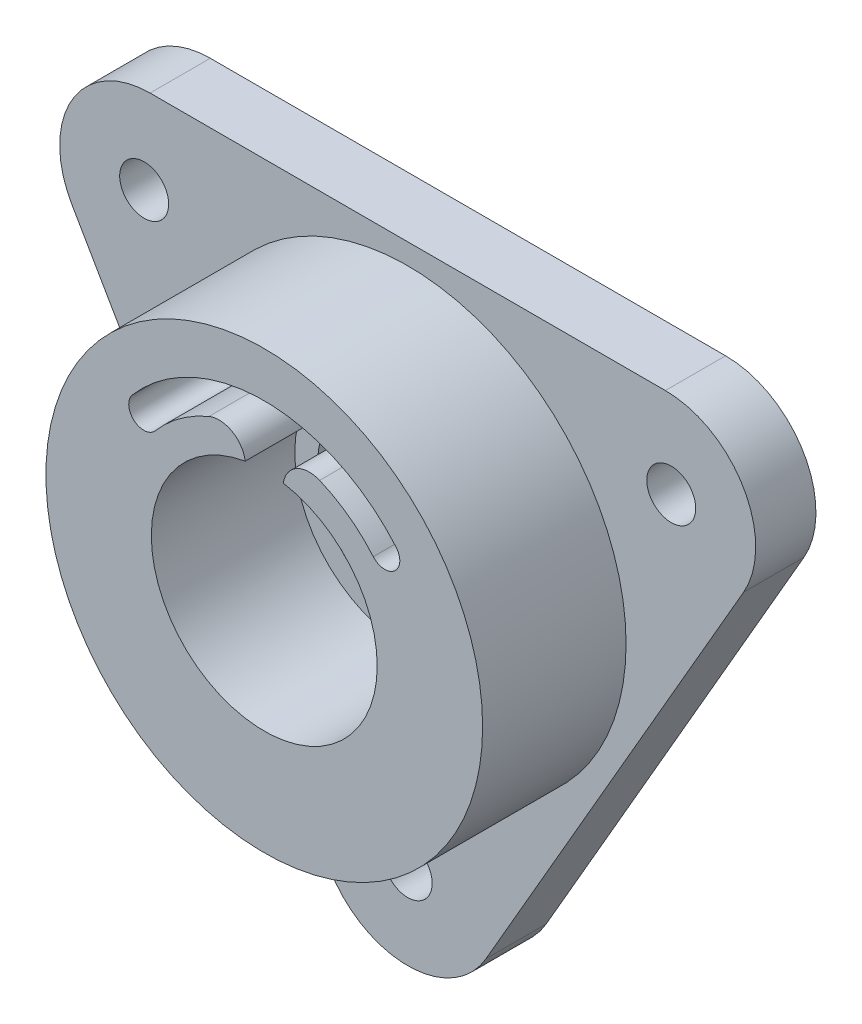
ISO-10303-21;
HEADER;
FILE_DESCRIPTION(('STEP AP214'),'2;1');
FILE_NAME('part.step','',(''),(''),'','','');
FILE_SCHEMA(('AUTOMOTIVE_DESIGN { 1 0 10303 214 1 1 1 1 }'));
ENDSEC;
DATA;
#1=APPLICATION_CONTEXT('core data for automotive mechanical design processes');
#2=APPLICATION_PROTOCOL_DEFINITION('international standard','automotive_design',2000,#1);
#3=PRODUCT_CONTEXT('',#1,'mechanical');
#4=PRODUCT('Part','Part','',(#3));
#5=PRODUCT_RELATED_PRODUCT_CATEGORY('part','',(#4));
#6=PRODUCT_DEFINITION_FORMATION('','',#4);
#7=PRODUCT_DEFINITION_CONTEXT('part definition',#1,'design');
#8=PRODUCT_DEFINITION('design','',#6,#7);
#9=PRODUCT_DEFINITION_SHAPE('','',#8);
#10=(LENGTH_UNIT() NAMED_UNIT(*) SI_UNIT(.MILLI.,.METRE.));
#11=(NAMED_UNIT(*) PLANE_ANGLE_UNIT() SI_UNIT($,.RADIAN.));
#12=(NAMED_UNIT(*) SI_UNIT($,.STERADIAN.) SOLID_ANGLE_UNIT());
#13=UNCERTAINTY_MEASURE_WITH_UNIT(LENGTH_MEASURE(1.E-05),#10,'distance_accuracy_value','');
#14=(GEOMETRIC_REPRESENTATION_CONTEXT(3) GLOBAL_UNCERTAINTY_ASSIGNED_CONTEXT((#13)) GLOBAL_UNIT_ASSIGNED_CONTEXT((#10,
#11,#12)) REPRESENTATION_CONTEXT('',''));
#15=CARTESIAN_POINT('',(0.,0.,0.));
#16=DIRECTION('',(0.,0.,1.));
#17=DIRECTION('',(1.,0.,0.));
#18=AXIS2_PLACEMENT_3D('',#15,#16,#17);
#19=CARTESIAN_POINT('',(0.,0.,0.));
#20=DIRECTION('',(0.,0.,-1.));
#21=DIRECTION('',(-1.,0.,0.));
#22=AXIS2_PLACEMENT_3D('',#19,#20,#21);
#23=PLANE('',#22);
#24=CARTESIAN_POINT('',(-17.5,10.1036297108185,0.));
#25=DIRECTION('',(0.,0.,1.));
#26=DIRECTION('',(1.,0.,0.));
#27=AXIS2_PLACEMENT_3D('',#24,#25,#26);
#28=CIRCLE('',#27,1.625);
#29=CARTESIAN_POINT('',(-15.875,10.1036297108185,0.));
#30=VERTEX_POINT('',#29);
#31=EDGE_CURVE('E182',#30,#30,#28,.T.);
#32=ORIENTED_EDGE('',*,*,#31,.T.);
#33=EDGE_LOOP('',(#32));
#34=FACE_BOUND('',#33,.T.);
#35=CARTESIAN_POINT('',(17.5,10.1036297108185,0.));
#36=DIRECTION('',(0.,0.,1.));
#37=DIRECTION('',(1.,0.,0.));
#38=AXIS2_PLACEMENT_3D('',#35,#36,#37);
#39=CIRCLE('',#38,1.625);
#40=CARTESIAN_POINT('',(19.125,10.1036297108185,0.));
#41=VERTEX_POINT('',#40);
#42=EDGE_CURVE('E201',#41,#41,#39,.T.);
#43=ORIENTED_EDGE('',*,*,#42,.T.);
#44=EDGE_LOOP('',(#43));
#45=FACE_BOUND('',#44,.T.);
#46=DIRECTION('',(-1.,0.,0.));
#47=VECTOR('',#46,1.);
#48=CARTESIAN_POINT('',(-27.5,15.8771324027147,0.));
#49=LINE('',#48,#47);
#50=CARTESIAN_POINT('',(17.1076951545867,15.8771324027147,0.));
#51=VERTEX_POINT('',#50);
#52=CARTESIAN_POINT('',(-17.1076951545867,15.8771324027147,0.));
#53=VERTEX_POINT('',#52);
#54=EDGE_CURVE('E230',#51,#53,#49,.T.);
#55=ORIENTED_EDGE('',*,*,#54,.F.);
#56=CARTESIAN_POINT('',(17.1076951545867,9.87713240271472,0.));
#57=DIRECTION('',(0.,0.,-1.));
#58=DIRECTION('',(-1.,0.,0.));
#59=AXIS2_PLACEMENT_3D('',#56,#57,#58);
#60=CIRCLE('',#59,6.);
#61=CARTESIAN_POINT('',(22.3038475772934,6.87713240271471,0.));
#62=VERTEX_POINT('',#61);
#63=EDGE_CURVE('E250',#51,#62,#60,.T.);
#64=ORIENTED_EDGE('',*,*,#63,.T.);
#65=DIRECTION('',(0.5,0.866025403784439,0.));
#66=VECTOR('',#65,1.);
#67=CARTESIAN_POINT('',(27.5,15.8771324027147,0.));
#68=LINE('',#67,#66);
#69=CARTESIAN_POINT('',(5.19615242270663,-22.7542648054294,0.));
#70=VERTEX_POINT('',#69);
#71=EDGE_CURVE('E209',#70,#62,#68,.T.);
#72=ORIENTED_EDGE('',*,*,#71,.F.);
#73=CARTESIAN_POINT('',(0.,-19.7542648054294,0.));
#74=DIRECTION('',(0.,0.,-1.));
#75=DIRECTION('',(-1.,0.,0.));
#76=AXIS2_PLACEMENT_3D('',#73,#74,#75);
#77=CIRCLE('',#76,6.);
#78=CARTESIAN_POINT('',(-5.19615242270664,-22.7542648054294,0.));
#79=VERTEX_POINT('',#78);
#80=EDGE_CURVE('E244',#70,#79,#77,.T.);
#81=ORIENTED_EDGE('',*,*,#80,.T.);
#82=DIRECTION('',(0.5,-0.866025403784439,0.));
#83=VECTOR('',#82,1.);
#84=CARTESIAN_POINT('',(0.,-31.7542648054294,0.));
#85=LINE('',#84,#83);
#86=CARTESIAN_POINT('',(-22.3038475772934,6.87713240271472,0.));
#87=VERTEX_POINT('',#86);
#88=EDGE_CURVE('E218',#87,#79,#85,.T.);
#89=ORIENTED_EDGE('',*,*,#88,.F.);
#90=CARTESIAN_POINT('',(-17.1076951545867,9.87713240271472,0.));
#91=DIRECTION('',(0.,0.,-1.));
#92=DIRECTION('',(-1.,0.,0.));
#93=AXIS2_PLACEMENT_3D('',#90,#91,#92);
#94=CIRCLE('',#93,6.);
#95=EDGE_CURVE('E247',#87,#53,#94,.T.);
#96=ORIENTED_EDGE('',*,*,#95,.T.);
#97=EDGE_LOOP('',(#55,#64,#72,#81,#89,#96));
#98=FACE_BOUND('',#97,.T.);
#99=CARTESIAN_POINT('',(0.,-20.2072594216369,0.));
#100=DIRECTION('',(0.,0.,1.));
#101=DIRECTION('',(1.,0.,0.));
#102=AXIS2_PLACEMENT_3D('',#99,#100,#101);
#103=CIRCLE('',#102,1.625);
#104=CARTESIAN_POINT('',(1.62500000000001,-20.2072594216369,0.));
#105=VERTEX_POINT('',#104);
#106=EDGE_CURVE('E193',#105,#105,#103,.T.);
#107=ORIENTED_EDGE('',*,*,#106,.T.);
#108=EDGE_LOOP('',(#107));
#109=FACE_BOUND('',#108,.T.);
#110=CARTESIAN_POINT('',(3.,7.14580296397823,0.));
#111=DIRECTION('',(0.,0.,-1.));
#112=DIRECTION('',(1.,0.,0.));
#113=AXIS2_PLACEMENT_3D('',#110,#111,#112);
#114=CIRCLE('',#113,1.75);
#115=CARTESIAN_POINT('',(2.32258064516129,5.53223455275734,0.));
#116=VERTEX_POINT('',#115);
#117=CARTESIAN_POINT('',(3.67741935483871,8.75937137519911,0.));
#118=VERTEX_POINT('',#117);
#119=EDGE_CURVE('E172',#116,#118,#114,.T.);
#120=ORIENTED_EDGE('',*,*,#119,.T.);
#121=CARTESIAN_POINT('',(0.,0.,0.));
#122=DIRECTION('',(0.,0.,-1.));
#123=DIRECTION('',(-1.,0.,0.));
#124=AXIS2_PLACEMENT_3D('',#121,#122,#123);
#125=CIRCLE('',#124,9.5);
#126=CARTESIAN_POINT('',(7.23809523809524,6.15304618252318,0.));
#127=VERTEX_POINT('',#126);
#128=EDGE_CURVE('E515',#118,#127,#125,.T.);
#129=ORIENTED_EDGE('',*,*,#128,.T.);
#130=CARTESIAN_POINT('',(8.,6.80073525436772,0.));
#131=DIRECTION('',(0.,0.,1.));
#132=DIRECTION('',(1.,0.,0.));
#133=AXIS2_PLACEMENT_3D('',#130,#131,#132);
#134=CIRCLE('',#133,1.);
#135=CARTESIAN_POINT('',(8.76190476190476,7.44842432621227,0.));
#136=VERTEX_POINT('',#135);
#137=EDGE_CURVE('E509',#127,#136,#134,.T.);
#138=ORIENTED_EDGE('',*,*,#137,.T.);
#139=CARTESIAN_POINT('',(0.,0.,0.));
#140=DIRECTION('',(0.,0.,1.));
#141=DIRECTION('',(1.,0.,0.));
#142=AXIS2_PLACEMENT_3D('',#139,#140,#141);
#143=CIRCLE('',#142,11.5);
#144=CARTESIAN_POINT('',(-8.76190476190476,7.44842432621227,0.));
#145=VERTEX_POINT('',#144);
#146=EDGE_CURVE('E484',#136,#145,#143,.T.);
#147=ORIENTED_EDGE('',*,*,#146,.T.);
#148=CARTESIAN_POINT('',(-8.,6.80073525436772,0.));
#149=DIRECTION('',(0.,0.,1.));
#150=DIRECTION('',(1.,0.,0.));
#151=AXIS2_PLACEMENT_3D('',#148,#149,#150);
#152=CIRCLE('',#151,1.);
#153=CARTESIAN_POINT('',(-7.23809523809524,6.15304618252318,0.));
#154=VERTEX_POINT('',#153);
#155=EDGE_CURVE('E499',#145,#154,#152,.T.);
#156=ORIENTED_EDGE('',*,*,#155,.T.);
#157=CARTESIAN_POINT('',(-3.67741935483871,8.75937137519911,0.));
#158=VERTEX_POINT('',#157);
#159=EDGE_CURVE('E170',#154,#158,#125,.T.);
#160=ORIENTED_EDGE('',*,*,#159,.T.);
#161=CARTESIAN_POINT('',(-3.,7.14580296397823,0.));
#162=DIRECTION('',(0.,0.,-1.));
#163=DIRECTION('',(1.,0.,0.));
#164=AXIS2_PLACEMENT_3D('',#161,#162,#163);
#165=CIRCLE('',#164,1.75);
#166=CARTESIAN_POINT('',(-2.32258064516129,5.53223455275734,0.));
#167=VERTEX_POINT('',#166);
#168=EDGE_CURVE('E55',#158,#167,#165,.T.);
#169=ORIENTED_EDGE('',*,*,#168,.T.);
#170=CARTESIAN_POINT('',(0.,0.,0.));
#171=DIRECTION('',(0.,0.,1.));
#172=DIRECTION('',(1.,0.,0.));
#173=AXIS2_PLACEMENT_3D('',#170,#171,#172);
#174=CIRCLE('',#173,6.);
#175=EDGE_CURVE('E167',#167,#116,#174,.T.);
#176=ORIENTED_EDGE('',*,*,#175,.T.);
#177=EDGE_LOOP('',(#120,#129,#138,#147,#156,#160,#169,#176));
#178=FACE_BOUND('',#177,.T.);
#179=ADVANCED_FACE('F39',(#34,#45,#98,#109,#178),#23,.T.);
#180=CARTESIAN_POINT('',(0.,0.,13.525));
#181=DIRECTION('',(0.,0.,1.));
#182=DIRECTION('',(1.,0.,0.));
#183=AXIS2_PLACEMENT_3D('',#180,#181,#182);
#184=PLANE('',#183);
#185=CARTESIAN_POINT('',(0.,0.,13.525));
#186=DIRECTION('',(0.,0.,1.));
#187=DIRECTION('',(1.,0.,0.));
#188=AXIS2_PLACEMENT_3D('',#185,#186,#187);
#189=CIRCLE('',#188,14.5);
#190=CARTESIAN_POINT('',(14.5,0.,13.525));
#191=VERTEX_POINT('',#190);
#192=EDGE_CURVE('E178',#191,#191,#189,.T.);
#193=ORIENTED_EDGE('',*,*,#192,.T.);
#194=EDGE_LOOP('',(#193));
#195=FACE_BOUND('',#194,.T.);
#196=CARTESIAN_POINT('',(3.,7.14580296397823,13.525));
#197=DIRECTION('',(0.,0.,-1.));
#198=DIRECTION('',(1.,0.,0.));
#199=AXIS2_PLACEMENT_3D('',#196,#197,#198);
#200=CIRCLE('',#199,1.75);
#201=CARTESIAN_POINT('',(1.2674235171821,7.39213349636583,13.525));
#202=VERTEX_POINT('',#201);
#203=CARTESIAN_POINT('',(3.67741935483871,8.75937137519911,13.525));
#204=VERTEX_POINT('',#203);
#205=EDGE_CURVE('E63',#202,#204,#200,.T.);
#206=ORIENTED_EDGE('',*,*,#205,.F.);
#207=CARTESIAN_POINT('',(0.,0.,13.525));
#208=DIRECTION('',(0.,0.,1.));
#209=DIRECTION('',(1.,0.,0.));
#210=AXIS2_PLACEMENT_3D('',#207,#208,#209);
#211=CIRCLE('',#210,7.5);
#212=CARTESIAN_POINT('',(-1.2674235171821,7.39213349636583,13.525));
#213=VERTEX_POINT('',#212);
#214=EDGE_CURVE('E185',#213,#202,#211,.T.);
#215=ORIENTED_EDGE('',*,*,#214,.F.);
#216=CARTESIAN_POINT('',(-3.,7.14580296397823,13.525));
#217=DIRECTION('',(0.,0.,-1.));
#218=DIRECTION('',(1.,0.,0.));
#219=AXIS2_PLACEMENT_3D('',#216,#217,#218);
#220=CIRCLE('',#219,1.75);
#221=CARTESIAN_POINT('',(-3.67741935483871,8.75937137519911,13.525));
#222=VERTEX_POINT('',#221);
#223=EDGE_CURVE('E487',#222,#213,#220,.T.);
#224=ORIENTED_EDGE('',*,*,#223,.F.);
#225=CARTESIAN_POINT('',(0.,0.,13.525));
#226=DIRECTION('',(0.,0.,-1.));
#227=DIRECTION('',(-1.,0.,0.));
#228=AXIS2_PLACEMENT_3D('',#225,#226,#227);
#229=CIRCLE('',#228,9.5);
#230=CARTESIAN_POINT('',(-7.23809523809524,6.15304618252318,13.525));
#231=VERTEX_POINT('',#230);
#232=EDGE_CURVE('E481',#231,#222,#229,.T.);
#233=ORIENTED_EDGE('',*,*,#232,.F.);
#234=CARTESIAN_POINT('',(-8.,6.80073525436772,13.525));
#235=DIRECTION('',(0.,0.,1.));
#236=DIRECTION('',(1.,0.,0.));
#237=AXIS2_PLACEMENT_3D('',#234,#235,#236);
#238=CIRCLE('',#237,1.);
#239=CARTESIAN_POINT('',(-8.76190476190476,7.44842432621227,13.525));
#240=VERTEX_POINT('',#239);
#241=EDGE_CURVE('E469',#240,#231,#238,.T.);
#242=ORIENTED_EDGE('',*,*,#241,.F.);
#243=CARTESIAN_POINT('',(0.,0.,13.525));
#244=DIRECTION('',(0.,0.,1.));
#245=DIRECTION('',(1.,0.,0.));
#246=AXIS2_PLACEMENT_3D('',#243,#244,#245);
#247=CIRCLE('',#246,11.5);
#248=CARTESIAN_POINT('',(8.76190476190476,7.44842432621227,13.525));
#249=VERTEX_POINT('',#248);
#250=EDGE_CURVE('E494',#249,#240,#247,.T.);
#251=ORIENTED_EDGE('',*,*,#250,.F.);
#252=CARTESIAN_POINT('',(8.,6.80073525436772,13.525));
#253=DIRECTION('',(0.,0.,1.));
#254=DIRECTION('',(1.,0.,0.));
#255=AXIS2_PLACEMENT_3D('',#252,#253,#254);
#256=CIRCLE('',#255,1.);
#257=CARTESIAN_POINT('',(7.23809523809524,6.15304618252318,13.525));
#258=VERTEX_POINT('',#257);
#259=EDGE_CURVE('E489',#258,#249,#256,.T.);
#260=ORIENTED_EDGE('',*,*,#259,.F.);
#261=EDGE_CURVE('E478',#204,#258,#229,.T.);
#262=ORIENTED_EDGE('',*,*,#261,.F.);
#263=EDGE_LOOP('',(#206,#215,#224,#233,#242,#251,#260,#262));
#264=FACE_BOUND('',#263,.T.);
#265=ADVANCED_FACE('F309',(#195,#264),#184,.T.);
#266=CARTESIAN_POINT('',(0.,0.,4.));
#267=DIRECTION('',(0.,0.,-1.));
#268=DIRECTION('',(-1.,0.,0.));
#269=AXIS2_PLACEMENT_3D('',#266,#267,#268);
#270=PLANE('',#269);
#271=CARTESIAN_POINT('',(0.,0.,4.));
#272=DIRECTION('',(0.,0.,1.));
#273=DIRECTION('',(1.,0.,0.));
#274=AXIS2_PLACEMENT_3D('',#271,#272,#273);
#275=CIRCLE('',#274,7.5);
#276=CARTESIAN_POINT('',(-1.2674235171821,7.39213349636583,4.));
#277=VERTEX_POINT('',#276);
#278=CARTESIAN_POINT('',(1.2674235171821,7.39213349636583,4.));
#279=VERTEX_POINT('',#278);
#280=EDGE_CURVE('E347',#277,#279,#275,.T.);
#281=ORIENTED_EDGE('',*,*,#280,.T.);
#282=CARTESIAN_POINT('',(3.,7.14580296397823,4.));
#283=DIRECTION('',(0.,0.,-1.));
#284=DIRECTION('',(-1.,0.,0.));
#285=AXIS2_PLACEMENT_3D('',#282,#283,#284);
#286=CIRCLE('',#285,1.75);
#287=CARTESIAN_POINT('',(2.32258064516129,5.53223455275734,4.));
#288=VERTEX_POINT('',#287);
#289=EDGE_CURVE('E348',#279,#288,#286,.F.);
#290=ORIENTED_EDGE('',*,*,#289,.T.);
#291=CARTESIAN_POINT('',(0.,0.,4.));
#292=DIRECTION('',(0.,0.,1.));
#293=DIRECTION('',(1.,0.,0.));
#294=AXIS2_PLACEMENT_3D('',#291,#292,#293);
#295=CIRCLE('',#294,6.);
#296=CARTESIAN_POINT('',(-2.32258064516129,5.53223455275734,4.));
#297=VERTEX_POINT('',#296);
#298=EDGE_CURVE('E177',#297,#288,#295,.T.);
#299=ORIENTED_EDGE('',*,*,#298,.F.);
#300=CARTESIAN_POINT('',(-3.,7.14580296397823,4.));
#301=DIRECTION('',(0.,0.,-1.));
#302=DIRECTION('',(-1.,0.,0.));
#303=AXIS2_PLACEMENT_3D('',#300,#301,#302);
#304=CIRCLE('',#303,1.75);
#305=EDGE_CURVE('E154',#297,#277,#304,.F.);
#306=ORIENTED_EDGE('',*,*,#305,.T.);
#307=EDGE_LOOP('',(#281,#290,#299,#306));
#308=FACE_BOUND('',#307,.T.);
#309=ADVANCED_FACE('F315',(#308),#270,.F.);
#310=CARTESIAN_POINT('',(0.,0.,0.));
#311=DIRECTION('',(0.,0.,1.));
#312=DIRECTION('',(1.,0.,0.));
#313=AXIS2_PLACEMENT_3D('',#310,#311,#312);
#314=CYLINDRICAL_SURFACE('',#313,9.5);
#315=DIRECTION('',(0.,0.,1.));
#316=VECTOR('',#315,1.);
#317=CARTESIAN_POINT('',(-3.67741935483871,8.75937137519911,0.));
#318=LINE('',#317,#316);
#319=EDGE_CURVE('E161',#158,#222,#318,.T.);
#320=ORIENTED_EDGE('',*,*,#319,.F.);
#321=ORIENTED_EDGE('',*,*,#159,.F.);
#322=DIRECTION('',(0.,0.,1.));
#323=VECTOR('',#322,1.);
#324=CARTESIAN_POINT('',(-7.23809523809524,6.15304618252318,0.));
#325=LINE('',#324,#323);
#326=EDGE_CURVE('E472',#154,#231,#325,.T.);
#327=ORIENTED_EDGE('',*,*,#326,.T.);
#328=ORIENTED_EDGE('',*,*,#232,.T.);
#329=EDGE_LOOP('',(#320,#321,#327,#328));
#330=FACE_BOUND('',#329,.T.);
#331=ADVANCED_FACE('F331',(#330),#314,.T.);
#332=CARTESIAN_POINT('',(0.,0.,4.));
#333=DIRECTION('',(0.,0.,1.));
#334=DIRECTION('',(1.,0.,0.));
#335=AXIS2_PLACEMENT_3D('',#332,#333,#334);
#336=CIRCLE('',#335,14.5);
#337=CARTESIAN_POINT('',(14.5,0.,4.));
#338=VERTEX_POINT('',#337);
#339=EDGE_CURVE('E226',#338,#338,#336,.T.);
#340=ORIENTED_EDGE('',*,*,#339,.F.);
#341=EDGE_LOOP('',(#340));
#342=FACE_BOUND('',#341,.T.);
#343=DIRECTION('',(0.5,0.866025403784439,0.));
#344=VECTOR('',#343,1.);
#345=CARTESIAN_POINT('',(27.5,15.8771324027147,4.));
#346=LINE('',#345,#344);
#347=CARTESIAN_POINT('',(5.19615242270663,-22.7542648054294,4.));
#348=VERTEX_POINT('',#347);
#349=CARTESIAN_POINT('',(22.3038475772934,6.87713240271471,4.));
#350=VERTEX_POINT('',#349);
#351=EDGE_CURVE('E213',#348,#350,#346,.T.);
#352=ORIENTED_EDGE('',*,*,#351,.T.);
#353=CARTESIAN_POINT('',(17.1076951545867,9.87713240271472,4.));
#354=DIRECTION('',(0.,0.,-1.));
#355=DIRECTION('',(-1.,0.,0.));
#356=AXIS2_PLACEMENT_3D('',#353,#354,#355);
#357=CIRCLE('',#356,6.);
#358=CARTESIAN_POINT('',(17.1076951545867,15.8771324027147,4.));
#359=VERTEX_POINT('',#358);
#360=EDGE_CURVE('E266',#350,#359,#357,.F.);
#361=ORIENTED_EDGE('',*,*,#360,.T.);
#362=DIRECTION('',(-1.,0.,0.));
#363=VECTOR('',#362,1.);
#364=CARTESIAN_POINT('',(-27.5,15.8771324027147,4.));
#365=LINE('',#364,#363);
#366=CARTESIAN_POINT('',(-17.1076951545867,15.8771324027147,4.));
#367=VERTEX_POINT('',#366);
#368=EDGE_CURVE('E217',#359,#367,#365,.T.);
#369=ORIENTED_EDGE('',*,*,#368,.T.);
#370=CARTESIAN_POINT('',(-17.1076951545867,9.87713240271472,4.));
#371=DIRECTION('',(0.,0.,-1.));
#372=DIRECTION('',(-1.,0.,0.));
#373=AXIS2_PLACEMENT_3D('',#370,#371,#372);
#374=CIRCLE('',#373,6.);
#375=CARTESIAN_POINT('',(-22.3038475772934,6.87713240271472,4.));
#376=VERTEX_POINT('',#375);
#377=EDGE_CURVE('E263',#367,#376,#374,.F.);
#378=ORIENTED_EDGE('',*,*,#377,.T.);
#379=DIRECTION('',(0.5,-0.866025403784439,0.));
#380=VECTOR('',#379,1.);
#381=CARTESIAN_POINT('',(0.,-31.7542648054294,4.));
#382=LINE('',#381,#380);
#383=CARTESIAN_POINT('',(-5.19615242270664,-22.7542648054294,4.));
#384=VERTEX_POINT('',#383);
#385=EDGE_CURVE('E222',#376,#384,#382,.T.);
#386=ORIENTED_EDGE('',*,*,#385,.T.);
#387=CARTESIAN_POINT('',(0.,-19.7542648054294,4.));
#388=DIRECTION('',(0.,0.,-1.));
#389=DIRECTION('',(-1.,0.,0.));
#390=AXIS2_PLACEMENT_3D('',#387,#388,#389);
#391=CIRCLE('',#390,6.);
#392=EDGE_CURVE('E260',#384,#348,#391,.F.);
#393=ORIENTED_EDGE('',*,*,#392,.T.);
#394=EDGE_LOOP('',(#352,#361,#369,#378,#386,#393));
#395=FACE_BOUND('',#394,.T.);
#396=CARTESIAN_POINT('',(17.5,10.1036297108185,4.));
#397=DIRECTION('',(0.,0.,1.));
#398=DIRECTION('',(1.,0.,0.));
#399=AXIS2_PLACEMENT_3D('',#396,#397,#398);
#400=CIRCLE('',#399,1.625);
#401=CARTESIAN_POINT('',(19.125,10.1036297108185,4.));
#402=VERTEX_POINT('',#401);
#403=EDGE_CURVE('E205',#402,#402,#400,.T.);
#404=ORIENTED_EDGE('',*,*,#403,.F.);
#405=EDGE_LOOP('',(#404));
#406=FACE_BOUND('',#405,.T.);
#407=CARTESIAN_POINT('',(0.,-20.2072594216369,4.));
#408=DIRECTION('',(0.,0.,1.));
#409=DIRECTION('',(1.,0.,0.));
#410=AXIS2_PLACEMENT_3D('',#407,#408,#409);
#411=CIRCLE('',#410,1.625);
#412=CARTESIAN_POINT('',(1.62500000000001,-20.2072594216369,4.));
#413=VERTEX_POINT('',#412);
#414=EDGE_CURVE('E197',#413,#413,#411,.T.);
#415=ORIENTED_EDGE('',*,*,#414,.F.);
#416=EDGE_LOOP('',(#415));
#417=FACE_BOUND('',#416,.T.);
#418=CARTESIAN_POINT('',(-17.5,10.1036297108185,4.));
#419=DIRECTION('',(0.,0.,1.));
#420=DIRECTION('',(1.,0.,0.));
#421=AXIS2_PLACEMENT_3D('',#418,#419,#420);
#422=CIRCLE('',#421,1.625);
#423=CARTESIAN_POINT('',(-15.875,10.1036297108185,4.));
#424=VERTEX_POINT('',#423);
#425=EDGE_CURVE('E189',#424,#424,#422,.T.);
#426=ORIENTED_EDGE('',*,*,#425,.F.);
#427=EDGE_LOOP('',(#426));
#428=FACE_BOUND('',#427,.T.);
#429=ADVANCED_FACE('F278',(#342,#395,#406,#417,#428),#270,.F.);
#430=CARTESIAN_POINT('',(27.5,15.8771324027147,4.));
#431=DIRECTION('',(-0.866025403784438,0.5,0.));
#432=DIRECTION('',(-0.5,-0.866025403784439,0.));
#433=AXIS2_PLACEMENT_3D('',#430,#431,#432);
#434=PLANE('',#433);
#435=ORIENTED_EDGE('',*,*,#71,.T.);
#436=DIRECTION('',(0.,0.,-1.));
#437=VECTOR('',#436,1.);
#438=CARTESIAN_POINT('',(22.3038475772934,6.87713240271471,4.));
#439=LINE('',#438,#437);
#440=EDGE_CURVE('E257',#62,#350,#439,.F.);
#441=ORIENTED_EDGE('',*,*,#440,.T.);
#442=ORIENTED_EDGE('',*,*,#351,.F.);
#443=DIRECTION('',(0.,0.,-1.));
#444=VECTOR('',#443,1.);
#445=CARTESIAN_POINT('',(5.19615242270663,-22.7542648054294,4.));
#446=LINE('',#445,#444);
#447=EDGE_CURVE('E253',#348,#70,#446,.T.);
#448=ORIENTED_EDGE('',*,*,#447,.T.);
#449=EDGE_LOOP('',(#435,#441,#442,#448));
#450=FACE_BOUND('',#449,.T.);
#451=ADVANCED_FACE('F285',(#450),#434,.F.);
#452=CARTESIAN_POINT('',(-27.5,15.8771324027147,4.));
#453=DIRECTION('',(0.,-1.,0.));
#454=DIRECTION('',(0.,0.,-1.));
#455=AXIS2_PLACEMENT_3D('',#452,#453,#454);
#456=PLANE('',#455);
#457=ORIENTED_EDGE('',*,*,#368,.F.);
#458=DIRECTION('',(0.,0.,-1.));
#459=VECTOR('',#458,1.);
#460=CARTESIAN_POINT('',(17.1076951545867,15.8771324027147,4.));
#461=LINE('',#460,#459);
#462=EDGE_CURVE('E240',#359,#51,#461,.T.);
#463=ORIENTED_EDGE('',*,*,#462,.T.);
#464=ORIENTED_EDGE('',*,*,#54,.T.);
#465=DIRECTION('',(0.,0.,-1.));
#466=VECTOR('',#465,1.);
#467=CARTESIAN_POINT('',(-17.1076951545867,15.8771324027147,4.));
#468=LINE('',#467,#466);
#469=EDGE_CURVE('E237',#53,#367,#468,.F.);
#470=ORIENTED_EDGE('',*,*,#469,.T.);
#471=EDGE_LOOP('',(#457,#463,#464,#470));
#472=FACE_BOUND('',#471,.T.);
#473=ADVANCED_FACE('F296',(#472),#456,.F.);
#474=CARTESIAN_POINT('',(0.,-31.7542648054294,4.));
#475=DIRECTION('',(0.866025403784439,0.5,0.));
#476=DIRECTION('',(-0.5,0.866025403784439,0.));
#477=AXIS2_PLACEMENT_3D('',#474,#475,#476);
#478=PLANE('',#477);
#479=ORIENTED_EDGE('',*,*,#385,.F.);
#480=DIRECTION('',(0.,0.,-1.));
#481=VECTOR('',#480,1.);
#482=CARTESIAN_POINT('',(-22.3038475772934,6.87713240271472,4.));
#483=LINE('',#482,#481);
#484=EDGE_CURVE('E11',#376,#87,#483,.T.);
#485=ORIENTED_EDGE('',*,*,#484,.T.);
#486=ORIENTED_EDGE('',*,*,#88,.T.);
#487=DIRECTION('',(0.,0.,-1.));
#488=VECTOR('',#487,1.);
#489=CARTESIAN_POINT('',(-5.19615242270664,-22.7542648054294,4.));
#490=LINE('',#489,#488);
#491=EDGE_CURVE('E48',#79,#384,#490,.F.);
#492=ORIENTED_EDGE('',*,*,#491,.T.);
#493=EDGE_LOOP('',(#479,#485,#486,#492));
#494=FACE_BOUND('',#493,.T.);
#495=ADVANCED_FACE('F272',(#494),#478,.F.);
#496=CARTESIAN_POINT('',(17.5,10.1036297108185,4.));
#497=DIRECTION('',(0.,0.,-1.));
#498=DIRECTION('',(-1.,0.,0.));
#499=AXIS2_PLACEMENT_3D('',#496,#497,#498);
#500=CYLINDRICAL_SURFACE('',#499,1.625);
#501=ORIENTED_EDGE('',*,*,#403,.T.);
#502=EDGE_LOOP('',(#501));
#503=FACE_BOUND('',#502,.T.);
#504=ORIENTED_EDGE('',*,*,#42,.F.);
#505=EDGE_LOOP('',(#504));
#506=FACE_BOUND('',#505,.T.);
#507=ADVANCED_FACE('F324',(#503,#506),#500,.F.);
#508=CARTESIAN_POINT('',(0.,-20.2072594216369,4.));
#509=DIRECTION('',(0.,0.,-1.));
#510=DIRECTION('',(-1.,0.,0.));
#511=AXIS2_PLACEMENT_3D('',#508,#509,#510);
#512=CYLINDRICAL_SURFACE('',#511,1.625);
#513=ORIENTED_EDGE('',*,*,#414,.T.);
#514=EDGE_LOOP('',(#513));
#515=FACE_BOUND('',#514,.T.);
#516=ORIENTED_EDGE('',*,*,#106,.F.);
#517=EDGE_LOOP('',(#516));
#518=FACE_BOUND('',#517,.T.);
#519=ADVANCED_FACE('F380',(#515,#518),#512,.F.);
#520=CARTESIAN_POINT('',(-17.5,10.1036297108185,4.));
#521=DIRECTION('',(0.,0.,-1.));
#522=DIRECTION('',(-1.,0.,0.));
#523=AXIS2_PLACEMENT_3D('',#520,#521,#522);
#524=CYLINDRICAL_SURFACE('',#523,1.625);
#525=ORIENTED_EDGE('',*,*,#425,.T.);
#526=EDGE_LOOP('',(#525));
#527=FACE_BOUND('',#526,.T.);
#528=ORIENTED_EDGE('',*,*,#31,.F.);
#529=EDGE_LOOP('',(#528));
#530=FACE_BOUND('',#529,.T.);
#531=ADVANCED_FACE('F374',(#527,#530),#524,.F.);
#532=CARTESIAN_POINT('',(0.,0.,4.));
#533=DIRECTION('',(0.,0.,-1.));
#534=DIRECTION('',(-1.,0.,0.));
#535=AXIS2_PLACEMENT_3D('',#532,#533,#534);
#536=CYLINDRICAL_SURFACE('',#535,6.);
#537=DIRECTION('',(0.,0.,1.));
#538=VECTOR('',#537,1.);
#539=CARTESIAN_POINT('',(2.32258064516129,5.53223455275734,0.));
#540=LINE('',#539,#538);
#541=EDGE_CURVE('E160',#116,#288,#540,.T.);
#542=ORIENTED_EDGE('',*,*,#541,.F.);
#543=ORIENTED_EDGE('',*,*,#175,.F.);
#544=DIRECTION('',(0.,0.,1.));
#545=VECTOR('',#544,1.);
#546=CARTESIAN_POINT('',(-2.32258064516129,5.53223455275734,0.));
#547=LINE('',#546,#545);
#548=EDGE_CURVE('E151',#167,#297,#547,.T.);
#549=ORIENTED_EDGE('',*,*,#548,.T.);
#550=ORIENTED_EDGE('',*,*,#298,.T.);
#551=EDGE_LOOP('',(#542,#543,#549,#550));
#552=FACE_BOUND('',#551,.T.);
#553=ADVANCED_FACE('F175',(#552),#536,.F.);
#554=CARTESIAN_POINT('',(0.,0.,13.525));
#555=DIRECTION('',(0.,0.,-1.));
#556=DIRECTION('',(-1.,0.,0.));
#557=AXIS2_PLACEMENT_3D('',#554,#555,#556);
#558=CYLINDRICAL_SURFACE('',#557,14.5);
#559=ORIENTED_EDGE('',*,*,#192,.F.);
#560=EDGE_LOOP('',(#559));
#561=FACE_BOUND('',#560,.T.);
#562=ORIENTED_EDGE('',*,*,#339,.T.);
#563=EDGE_LOOP('',(#562));
#564=FACE_BOUND('',#563,.T.);
#565=ADVANCED_FACE('F365',(#561,#564),#558,.T.);
#566=CARTESIAN_POINT('',(0.,0.,13.525));
#567=DIRECTION('',(0.,0.,-1.));
#568=DIRECTION('',(-1.,0.,0.));
#569=AXIS2_PLACEMENT_3D('',#566,#567,#568);
#570=CYLINDRICAL_SURFACE('',#569,7.5);
#571=DIRECTION('',(0.,0.,1.));
#572=VECTOR('',#571,1.);
#573=CARTESIAN_POINT('',(1.2674235171821,7.39213349636583,6.7625));
#574=LINE('',#573,#572);
#575=EDGE_CURVE('E525',#279,#202,#574,.T.);
#576=ORIENTED_EDGE('',*,*,#575,.F.);
#577=ORIENTED_EDGE('',*,*,#280,.F.);
#578=DIRECTION('',(0.,0.,1.));
#579=VECTOR('',#578,1.);
#580=CARTESIAN_POINT('',(-1.2674235171821,7.39213349636583,6.7625));
#581=LINE('',#580,#579);
#582=EDGE_CURVE('E530',#213,#277,#581,.F.);
#583=ORIENTED_EDGE('',*,*,#582,.F.);
#584=ORIENTED_EDGE('',*,*,#214,.T.);
#585=EDGE_LOOP('',(#576,#577,#583,#584));
#586=FACE_BOUND('',#585,.T.);
#587=ADVANCED_FACE('F306',(#586),#570,.F.);
#588=CARTESIAN_POINT('',(17.1076951545867,9.87713240271472,4.));
#589=DIRECTION('',(0.,0.,-1.));
#590=DIRECTION('',(-1.,0.,0.));
#591=AXIS2_PLACEMENT_3D('',#588,#589,#590);
#592=CYLINDRICAL_SURFACE('',#591,6.);
#593=ORIENTED_EDGE('',*,*,#360,.F.);
#594=ORIENTED_EDGE('',*,*,#440,.F.);
#595=ORIENTED_EDGE('',*,*,#63,.F.);
#596=ORIENTED_EDGE('',*,*,#462,.F.);
#597=EDGE_LOOP('',(#593,#594,#595,#596));
#598=FACE_BOUND('',#597,.T.);
#599=ADVANCED_FACE('F293',(#598),#592,.T.);
#600=CARTESIAN_POINT('',(-17.1076951545867,9.87713240271472,4.));
#601=DIRECTION('',(0.,0.,-1.));
#602=DIRECTION('',(-1.,0.,0.));
#603=AXIS2_PLACEMENT_3D('',#600,#601,#602);
#604=CYLINDRICAL_SURFACE('',#603,6.);
#605=ORIENTED_EDGE('',*,*,#377,.F.);
#606=ORIENTED_EDGE('',*,*,#469,.F.);
#607=ORIENTED_EDGE('',*,*,#95,.F.);
#608=ORIENTED_EDGE('',*,*,#484,.F.);
#609=EDGE_LOOP('',(#605,#606,#607,#608));
#610=FACE_BOUND('',#609,.T.);
#611=ADVANCED_FACE('F299',(#610),#604,.T.);
#612=CARTESIAN_POINT('',(0.,-19.7542648054294,4.));
#613=DIRECTION('',(0.,0.,-1.));
#614=DIRECTION('',(-1.,0.,0.));
#615=AXIS2_PLACEMENT_3D('',#612,#613,#614);
#616=CYLINDRICAL_SURFACE('',#615,6.);
#617=ORIENTED_EDGE('',*,*,#392,.F.);
#618=ORIENTED_EDGE('',*,*,#491,.F.);
#619=ORIENTED_EDGE('',*,*,#80,.F.);
#620=ORIENTED_EDGE('',*,*,#447,.F.);
#621=EDGE_LOOP('',(#617,#618,#619,#620));
#622=FACE_BOUND('',#621,.T.);
#623=ADVANCED_FACE('F41',(#622),#616,.T.);
#624=CARTESIAN_POINT('',(-8.,6.80073525436772,0.));
#625=DIRECTION('',(0.,0.,1.));
#626=DIRECTION('',(1.,0.,0.));
#627=AXIS2_PLACEMENT_3D('',#624,#625,#626);
#628=CYLINDRICAL_SURFACE('',#627,1.);
#629=ORIENTED_EDGE('',*,*,#241,.T.);
#630=ORIENTED_EDGE('',*,*,#326,.F.);
#631=ORIENTED_EDGE('',*,*,#155,.F.);
#632=DIRECTION('',(0.,0.,1.));
#633=VECTOR('',#632,1.);
#634=CARTESIAN_POINT('',(-8.76190476190476,7.44842432621227,0.));
#635=LINE('',#634,#633);
#636=EDGE_CURVE('E353',#145,#240,#635,.T.);
#637=ORIENTED_EDGE('',*,*,#636,.T.);
#638=EDGE_LOOP('',(#629,#630,#631,#637));
#639=FACE_BOUND('',#638,.T.);
#640=ADVANCED_FACE('F305',(#639),#628,.F.);
#641=CARTESIAN_POINT('',(0.,0.,0.));
#642=DIRECTION('',(0.,0.,1.));
#643=DIRECTION('',(1.,0.,0.));
#644=AXIS2_PLACEMENT_3D('',#641,#642,#643);
#645=CYLINDRICAL_SURFACE('',#644,11.5);
#646=ORIENTED_EDGE('',*,*,#250,.T.);
#647=ORIENTED_EDGE('',*,*,#636,.F.);
#648=ORIENTED_EDGE('',*,*,#146,.F.);
#649=DIRECTION('',(0.,0.,1.));
#650=VECTOR('',#649,1.);
#651=CARTESIAN_POINT('',(8.76190476190476,7.44842432621227,0.));
#652=LINE('',#651,#650);
#653=EDGE_CURVE('E359',#136,#249,#652,.T.);
#654=ORIENTED_EDGE('',*,*,#653,.T.);
#655=EDGE_LOOP('',(#646,#647,#648,#654));
#656=FACE_BOUND('',#655,.T.);
#657=ADVANCED_FACE('F458',(#656),#645,.F.);
#658=CARTESIAN_POINT('',(8.,6.80073525436772,0.));
#659=DIRECTION('',(0.,0.,1.));
#660=DIRECTION('',(1.,0.,0.));
#661=AXIS2_PLACEMENT_3D('',#658,#659,#660);
#662=CYLINDRICAL_SURFACE('',#661,1.);
#663=ORIENTED_EDGE('',*,*,#259,.T.);
#664=ORIENTED_EDGE('',*,*,#653,.F.);
#665=ORIENTED_EDGE('',*,*,#137,.F.);
#666=DIRECTION('',(0.,0.,1.));
#667=VECTOR('',#666,1.);
#668=CARTESIAN_POINT('',(7.23809523809524,6.15304618252318,0.));
#669=LINE('',#668,#667);
#670=EDGE_CURVE('E483',#127,#258,#669,.T.);
#671=ORIENTED_EDGE('',*,*,#670,.T.);
#672=EDGE_LOOP('',(#663,#664,#665,#671));
#673=FACE_BOUND('',#672,.T.);
#674=ADVANCED_FACE('F433',(#673),#662,.F.);
#675=ORIENTED_EDGE('',*,*,#128,.F.);
#676=DIRECTION('',(0.,0.,1.));
#677=VECTOR('',#676,1.);
#678=CARTESIAN_POINT('',(3.67741935483871,8.75937137519911,0.));
#679=LINE('',#678,#677);
#680=EDGE_CURVE('E533',#118,#204,#679,.T.);
#681=ORIENTED_EDGE('',*,*,#680,.T.);
#682=ORIENTED_EDGE('',*,*,#261,.T.);
#683=ORIENTED_EDGE('',*,*,#670,.F.);
#684=EDGE_LOOP('',(#675,#681,#682,#683));
#685=FACE_BOUND('',#684,.T.);
#686=ADVANCED_FACE('F338',(#685),#314,.T.);
#687=CARTESIAN_POINT('',(-3.,7.14580296397823,0.));
#688=DIRECTION('',(0.,0.,1.));
#689=DIRECTION('',(1.,0.,0.));
#690=AXIS2_PLACEMENT_3D('',#687,#688,#689);
#691=CYLINDRICAL_SURFACE('',#690,1.75);
#692=ORIENTED_EDGE('',*,*,#548,.F.);
#693=ORIENTED_EDGE('',*,*,#168,.F.);
#694=ORIENTED_EDGE('',*,*,#319,.T.);
#695=ORIENTED_EDGE('',*,*,#223,.T.);
#696=ORIENTED_EDGE('',*,*,#582,.T.);
#697=ORIENTED_EDGE('',*,*,#305,.F.);
#698=EDGE_LOOP('',(#692,#693,#694,#695,#696,#697));
#699=FACE_BOUND('',#698,.T.);
#700=ADVANCED_FACE('F152',(#699),#691,.T.);
#701=CARTESIAN_POINT('',(3.,7.14580296397823,0.));
#702=DIRECTION('',(0.,0.,1.));
#703=DIRECTION('',(1.,0.,0.));
#704=AXIS2_PLACEMENT_3D('',#701,#702,#703);
#705=CYLINDRICAL_SURFACE('',#704,1.75);
#706=ORIENTED_EDGE('',*,*,#575,.T.);
#707=ORIENTED_EDGE('',*,*,#205,.T.);
#708=ORIENTED_EDGE('',*,*,#680,.F.);
#709=ORIENTED_EDGE('',*,*,#119,.F.);
#710=ORIENTED_EDGE('',*,*,#541,.T.);
#711=ORIENTED_EDGE('',*,*,#289,.F.);
#712=EDGE_LOOP('',(#706,#707,#708,#709,#710,#711));
#713=FACE_BOUND('',#712,.T.);
#714=ADVANCED_FACE('F444',(#713),#705,.T.);
#715=CLOSED_SHELL('',(#179,#265,#309,#331,#429,#451,#473,#495,#507,#519,#531,#553,#565,#587,
#599,#611,#623,#640,#657,#674,#686,#700,#714));
#716=MANIFOLD_SOLID_BREP('B2',#715);
#717=ADVANCED_BREP_SHAPE_REPRESENTATION('',(#18,#716),#14);
#718=SHAPE_DEFINITION_REPRESENTATION(#9,#717);
ENDSEC;
END-ISO-10303-21;
